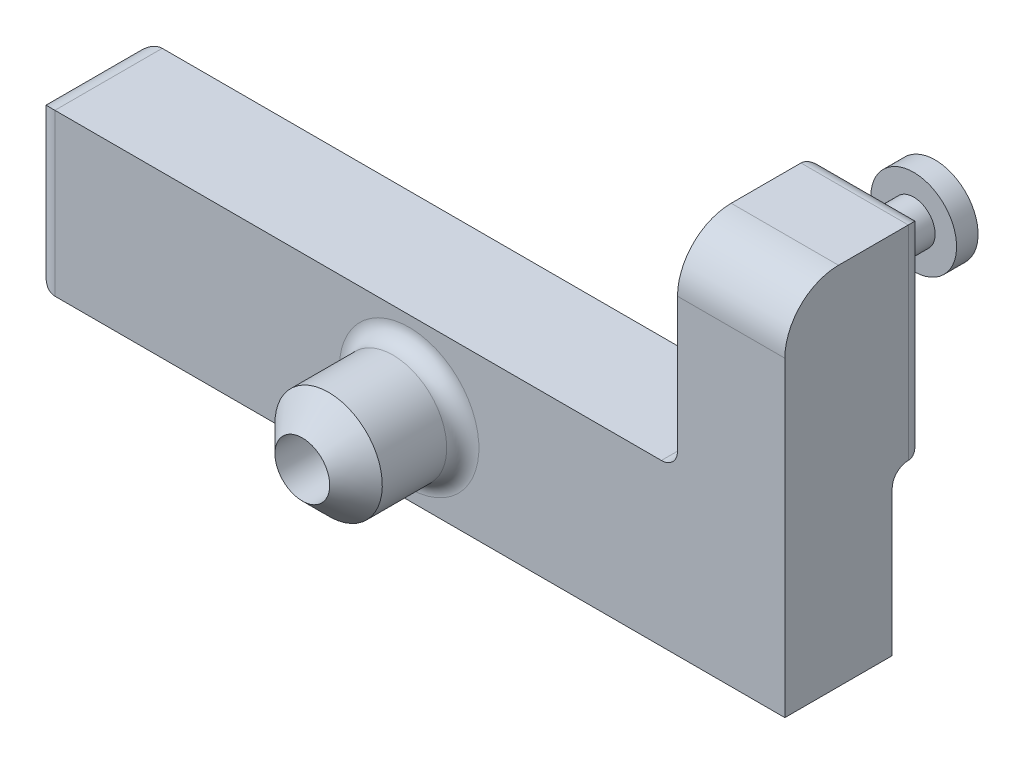
ISO-10303-21;
HEADER;
FILE_DESCRIPTION(('STEP AP214'),'2;1');
FILE_NAME('part.step','',(''),(''),'','','');
FILE_SCHEMA(('AUTOMOTIVE_DESIGN { 1 0 10303 214 1 1 1 1 }'));
ENDSEC;
DATA;
#1=APPLICATION_CONTEXT('core data for automotive mechanical design processes');
#2=APPLICATION_PROTOCOL_DEFINITION('international standard','automotive_design',2000,#1);
#3=PRODUCT_CONTEXT('',#1,'mechanical');
#4=PRODUCT('Part','Part','',(#3));
#5=PRODUCT_RELATED_PRODUCT_CATEGORY('part','',(#4));
#6=PRODUCT_DEFINITION_FORMATION('','',#4);
#7=PRODUCT_DEFINITION_CONTEXT('part definition',#1,'design');
#8=PRODUCT_DEFINITION('design','',#6,#7);
#9=PRODUCT_DEFINITION_SHAPE('','',#8);
#10=(LENGTH_UNIT() NAMED_UNIT(*) SI_UNIT(.MILLI.,.METRE.));
#11=(NAMED_UNIT(*) PLANE_ANGLE_UNIT() SI_UNIT($,.RADIAN.));
#12=(NAMED_UNIT(*) SI_UNIT($,.STERADIAN.) SOLID_ANGLE_UNIT());
#13=UNCERTAINTY_MEASURE_WITH_UNIT(LENGTH_MEASURE(1.E-05),#10,'distance_accuracy_value','');
#14=(GEOMETRIC_REPRESENTATION_CONTEXT(3) GLOBAL_UNCERTAINTY_ASSIGNED_CONTEXT((#13)) GLOBAL_UNIT_ASSIGNED_CONTEXT((#10,
#11,#12)) REPRESENTATION_CONTEXT('',''));
#15=CARTESIAN_POINT('',(0.,0.,0.));
#16=DIRECTION('',(0.,0.,1.));
#17=DIRECTION('',(1.,0.,0.));
#18=AXIS2_PLACEMENT_3D('',#15,#16,#17);
#19=CARTESIAN_POINT('',(30.,21.5,-7.));
#20=DIRECTION('',(0.,0.,1.));
#21=DIRECTION('',(1.,0.,0.));
#22=AXIS2_PLACEMENT_3D('',#19,#20,#21);
#23=CYLINDRICAL_SURFACE('',#22,2.);
#24=CARTESIAN_POINT('',(30.,21.5,-7.));
#25=DIRECTION('',(0.,0.,-1.));
#26=DIRECTION('',(-1.,0.,0.));
#27=AXIS2_PLACEMENT_3D('',#24,#25,#26);
#28=CIRCLE('',#27,2.);
#29=CARTESIAN_POINT('',(28.,21.5,-7.));
#30=VERTEX_POINT('',#29);
#31=EDGE_CURVE('E220',#30,#30,#28,.T.);
#32=ORIENTED_EDGE('',*,*,#31,.F.);
#33=EDGE_LOOP('',(#32));
#34=FACE_BOUND('',#33,.T.);
#35=CARTESIAN_POINT('',(30.,21.5,-3.));
#36=DIRECTION('',(0.,0.,-1.));
#37=DIRECTION('',(-1.,0.,0.));
#38=AXIS2_PLACEMENT_3D('',#35,#36,#37);
#39=CIRCLE('',#38,2.);
#40=CARTESIAN_POINT('',(28.,21.5,-3.));
#41=VERTEX_POINT('',#40);
#42=EDGE_CURVE('E219',#41,#41,#39,.T.);
#43=ORIENTED_EDGE('',*,*,#42,.T.);
#44=EDGE_LOOP('',(#43));
#45=FACE_BOUND('',#44,.T.);
#46=ADVANCED_FACE('F41',(#34,#45),#23,.T.);
#47=CARTESIAN_POINT('',(35.,26.5,-3.));
#48=DIRECTION('',(-1.,0.,0.));
#49=DIRECTION('',(0.,0.,1.));
#50=AXIS2_PLACEMENT_3D('',#47,#48,#49);
#51=PLANE('',#50);
#52=DIRECTION('',(0.,1.,0.));
#53=VECTOR('',#52,1.);
#54=CARTESIAN_POINT('',(35.,-7.5,0.));
#55=LINE('',#54,#53);
#56=CARTESIAN_POINT('',(35.,-7.5,0.));
#57=VERTEX_POINT('',#56);
#58=CARTESIAN_POINT('',(35.,6.,0.));
#59=VERTEX_POINT('',#58);
#60=EDGE_CURVE('E341',#57,#59,#55,.T.);
#61=ORIENTED_EDGE('',*,*,#60,.T.);
#62=CARTESIAN_POINT('',(35.,6.,-1.5));
#63=DIRECTION('',(-1.,0.,0.));
#64=DIRECTION('',(0.,0.,1.));
#65=AXIS2_PLACEMENT_3D('',#62,#63,#64);
#66=CIRCLE('',#65,1.5);
#67=CARTESIAN_POINT('',(35.,7.5,-1.5));
#68=VERTEX_POINT('',#67);
#69=EDGE_CURVE('E243',#59,#68,#66,.T.);
#70=ORIENTED_EDGE('',*,*,#69,.T.);
#71=DIRECTION('',(0.,-1.,0.));
#72=VECTOR('',#71,1.);
#73=CARTESIAN_POINT('',(35.,26.5,-1.5));
#74=LINE('',#73,#72);
#75=CARTESIAN_POINT('',(35.,26.5,-1.5));
#76=VERTEX_POINT('',#75);
#77=EDGE_CURVE('E239',#68,#76,#74,.F.);
#78=ORIENTED_EDGE('',*,*,#77,.T.);
#79=DIRECTION('',(0.,0.,1.));
#80=VECTOR('',#79,1.);
#81=CARTESIAN_POINT('',(35.,26.5,-3.));
#82=LINE('',#81,#80);
#83=CARTESIAN_POINT('',(35.,26.5,5.));
#84=VERTEX_POINT('',#83);
#85=EDGE_CURVE('E206',#76,#84,#82,.T.);
#86=ORIENTED_EDGE('',*,*,#85,.T.);
#87=CARTESIAN_POINT('',(35.,21.5,5.));
#88=DIRECTION('',(-1.,0.,0.));
#89=DIRECTION('',(0.,0.,1.));
#90=AXIS2_PLACEMENT_3D('',#87,#88,#89);
#91=CIRCLE('',#90,5.);
#92=CARTESIAN_POINT('',(35.,21.5,10.));
#93=VERTEX_POINT('',#92);
#94=EDGE_CURVE('E151',#84,#93,#91,.F.);
#95=ORIENTED_EDGE('',*,*,#94,.T.);
#96=DIRECTION('',(0.,-1.,0.));
#97=VECTOR('',#96,1.);
#98=CARTESIAN_POINT('',(35.,26.5,10.));
#99=LINE('',#98,#97);
#100=CARTESIAN_POINT('',(35.,-7.5,10.));
#101=VERTEX_POINT('',#100);
#102=EDGE_CURVE('E143',#93,#101,#99,.T.);
#103=ORIENTED_EDGE('',*,*,#102,.T.);
#104=DIRECTION('',(0.,0.,-1.));
#105=VECTOR('',#104,1.);
#106=CARTESIAN_POINT('',(35.,-7.5,10.));
#107=LINE('',#106,#105);
#108=EDGE_CURVE('E148',#101,#57,#107,.T.);
#109=ORIENTED_EDGE('',*,*,#108,.T.);
#110=EDGE_LOOP('',(#61,#70,#78,#86,#95,#103,#109));
#111=FACE_BOUND('',#110,.T.);
#112=ADVANCED_FACE('F146',(#111),#51,.F.);
#113=CARTESIAN_POINT('',(25.,26.5,-3.));
#114=DIRECTION('',(1.,0.,0.));
#115=DIRECTION('',(0.,1.,0.));
#116=AXIS2_PLACEMENT_3D('',#113,#114,#115);
#117=PLANE('',#116);
#118=DIRECTION('',(0.,1.,0.));
#119=VECTOR('',#118,1.);
#120=CARTESIAN_POINT('',(25.,7.50000000000001,-1.5));
#121=LINE('',#120,#119);
#122=CARTESIAN_POINT('',(25.,26.5,-1.5));
#123=VERTEX_POINT('',#122);
#124=CARTESIAN_POINT('',(25.,9.,-1.5));
#125=VERTEX_POINT('',#124);
#126=EDGE_CURVE('E235',#123,#125,#121,.F.);
#127=ORIENTED_EDGE('',*,*,#126,.T.);
#128=DIRECTION('',(0.,0.,1.));
#129=VECTOR('',#128,1.);
#130=CARTESIAN_POINT('',(25.,9.,10.));
#131=LINE('',#130,#129);
#132=CARTESIAN_POINT('',(25.,9.,10.));
#133=VERTEX_POINT('',#132);
#134=EDGE_CURVE('E64',#125,#133,#131,.T.);
#135=ORIENTED_EDGE('',*,*,#134,.T.);
#136=DIRECTION('',(0.,1.,0.));
#137=VECTOR('',#136,1.);
#138=CARTESIAN_POINT('',(25.,26.5,10.));
#139=LINE('',#138,#137);
#140=CARTESIAN_POINT('',(25.,21.5,10.));
#141=VERTEX_POINT('',#140);
#142=EDGE_CURVE('E154',#133,#141,#139,.T.);
#143=ORIENTED_EDGE('',*,*,#142,.T.);
#144=CARTESIAN_POINT('',(25.,21.5,5.));
#145=DIRECTION('',(1.,0.,0.));
#146=DIRECTION('',(0.,1.,0.));
#147=AXIS2_PLACEMENT_3D('',#144,#145,#146);
#148=CIRCLE('',#147,5.);
#149=CARTESIAN_POINT('',(25.,26.5,5.));
#150=VERTEX_POINT('',#149);
#151=EDGE_CURVE('E216',#141,#150,#148,.F.);
#152=ORIENTED_EDGE('',*,*,#151,.T.);
#153=DIRECTION('',(0.,0.,1.));
#154=VECTOR('',#153,1.);
#155=CARTESIAN_POINT('',(25.,26.5,-3.));
#156=LINE('',#155,#154);
#157=EDGE_CURVE('E208',#123,#150,#156,.T.);
#158=ORIENTED_EDGE('',*,*,#157,.F.);
#159=EDGE_LOOP('',(#127,#135,#143,#152,#158));
#160=FACE_BOUND('',#159,.T.);
#161=ADVANCED_FACE('F295',(#160),#117,.F.);
#162=CARTESIAN_POINT('',(35.,26.5,-3.));
#163=DIRECTION('',(0.,-1.,0.));
#164=DIRECTION('',(1.,0.,0.));
#165=AXIS2_PLACEMENT_3D('',#162,#163,#164);
#166=PLANE('',#165);
#167=ORIENTED_EDGE('',*,*,#85,.F.);
#168=DIRECTION('',(1.,0.,0.));
#169=VECTOR('',#168,1.);
#170=CARTESIAN_POINT('',(25.,26.5,-1.5));
#171=LINE('',#170,#169);
#172=EDGE_CURVE('E237',#76,#123,#171,.F.);
#173=ORIENTED_EDGE('',*,*,#172,.T.);
#174=ORIENTED_EDGE('',*,*,#157,.T.);
#175=DIRECTION('',(1.,0.,0.));
#176=VECTOR('',#175,1.);
#177=CARTESIAN_POINT('',(35.,26.5,5.));
#178=LINE('',#177,#176);
#179=EDGE_CURVE('E210',#150,#84,#178,.T.);
#180=ORIENTED_EDGE('',*,*,#179,.T.);
#181=EDGE_LOOP('',(#167,#173,#174,#180));
#182=FACE_BOUND('',#181,.T.);
#183=ADVANCED_FACE('F408',(#182),#166,.F.);
#184=CARTESIAN_POINT('',(0.,0.,-3.));
#185=DIRECTION('',(0.,0.,-1.));
#186=DIRECTION('',(-1.,0.,0.));
#187=AXIS2_PLACEMENT_3D('',#184,#185,#186);
#188=PLANE('',#187);
#189=DIRECTION('',(-1.,0.,0.));
#190=VECTOR('',#189,1.);
#191=CARTESIAN_POINT('',(25.,9.00000000000001,-3.));
#192=LINE('',#191,#190);
#193=CARTESIAN_POINT('',(33.5,9.,-3.));
#194=VERTEX_POINT('',#193);
#195=CARTESIAN_POINT('',(26.5,9.00000000000001,-3.));
#196=VERTEX_POINT('',#195);
#197=EDGE_CURVE('E223',#194,#196,#192,.T.);
#198=ORIENTED_EDGE('',*,*,#197,.T.);
#199=DIRECTION('',(0.,1.,0.));
#200=VECTOR('',#199,1.);
#201=CARTESIAN_POINT('',(26.5,26.5,-3.));
#202=LINE('',#201,#200);
#203=CARTESIAN_POINT('',(26.5,25.,-3.));
#204=VERTEX_POINT('',#203);
#205=EDGE_CURVE('E231',#196,#204,#202,.T.);
#206=ORIENTED_EDGE('',*,*,#205,.T.);
#207=DIRECTION('',(1.,0.,0.));
#208=VECTOR('',#207,1.);
#209=CARTESIAN_POINT('',(35.,25.,-3.));
#210=LINE('',#209,#208);
#211=CARTESIAN_POINT('',(33.5,25.,-3.));
#212=VERTEX_POINT('',#211);
#213=EDGE_CURVE('E229',#204,#212,#210,.T.);
#214=ORIENTED_EDGE('',*,*,#213,.T.);
#215=DIRECTION('',(0.,-1.,0.));
#216=VECTOR('',#215,1.);
#217=CARTESIAN_POINT('',(33.5,7.5,-3.));
#218=LINE('',#217,#216);
#219=EDGE_CURVE('E227',#212,#194,#218,.T.);
#220=ORIENTED_EDGE('',*,*,#219,.T.);
#221=EDGE_LOOP('',(#198,#206,#214,#220));
#222=FACE_BOUND('',#221,.T.);
#223=ORIENTED_EDGE('',*,*,#42,.F.);
#224=EDGE_LOOP('',(#223));
#225=FACE_BOUND('',#224,.T.);
#226=ADVANCED_FACE('F405',(#222,#225),#188,.T.);
#227=CARTESIAN_POINT('',(0.,0.,10.));
#228=DIRECTION('',(0.,0.,-1.));
#229=DIRECTION('',(-1.,0.,0.));
#230=AXIS2_PLACEMENT_3D('',#227,#228,#229);
#231=PLANE('',#230);
#232=CARTESIAN_POINT('',(0.,0.,10.));
#233=DIRECTION('',(0.,0.,-1.));
#234=DIRECTION('',(-1.,0.,0.));
#235=AXIS2_PLACEMENT_3D('',#232,#233,#234);
#236=CIRCLE('',#235,6.5);
#237=CARTESIAN_POINT('',(-6.5,0.,10.));
#238=VERTEX_POINT('',#237);
#239=EDGE_CURVE('E49',#238,#238,#236,.T.);
#240=ORIENTED_EDGE('',*,*,#239,.T.);
#241=EDGE_LOOP('',(#240));
#242=FACE_BOUND('',#241,.T.);
#243=ORIENTED_EDGE('',*,*,#102,.F.);
#244=DIRECTION('',(1.,0.,0.));
#245=VECTOR('',#244,1.);
#246=CARTESIAN_POINT('',(0.,21.5,10.));
#247=LINE('',#246,#245);
#248=EDGE_CURVE('E214',#93,#141,#247,.F.);
#249=ORIENTED_EDGE('',*,*,#248,.T.);
#250=ORIENTED_EDGE('',*,*,#142,.F.);
#251=CARTESIAN_POINT('',(23.5,9.,10.));
#252=DIRECTION('',(0.,0.,-1.));
#253=DIRECTION('',(-1.,0.,0.));
#254=AXIS2_PLACEMENT_3D('',#251,#252,#253);
#255=CIRCLE('',#254,1.5);
#256=CARTESIAN_POINT('',(23.5,7.5,10.));
#257=VERTEX_POINT('',#256);
#258=EDGE_CURVE('E56',#133,#257,#255,.T.);
#259=ORIENTED_EDGE('',*,*,#258,.T.);
#260=DIRECTION('',(-1.,0.,0.));
#261=VECTOR('',#260,1.);
#262=CARTESIAN_POINT('',(-35.,7.5,10.));
#263=LINE('',#262,#261);
#264=CARTESIAN_POINT('',(-33.,7.5,10.));
#265=VERTEX_POINT('',#264);
#266=EDGE_CURVE('E164',#257,#265,#263,.T.);
#267=ORIENTED_EDGE('',*,*,#266,.T.);
#268=DIRECTION('',(0.,-1.,0.));
#269=VECTOR('',#268,1.);
#270=CARTESIAN_POINT('',(-33.,0.,10.));
#271=LINE('',#270,#269);
#272=CARTESIAN_POINT('',(-33.,-7.5,10.));
#273=VERTEX_POINT('',#272);
#274=EDGE_CURVE('E161',#265,#273,#271,.T.);
#275=ORIENTED_EDGE('',*,*,#274,.T.);
#276=DIRECTION('',(1.,0.,0.));
#277=VECTOR('',#276,1.);
#278=CARTESIAN_POINT('',(-35.,-7.5,10.));
#279=LINE('',#278,#277);
#280=EDGE_CURVE('E158',#273,#101,#279,.T.);
#281=ORIENTED_EDGE('',*,*,#280,.T.);
#282=EDGE_LOOP('',(#243,#249,#250,#259,#267,#275,#281));
#283=FACE_BOUND('',#282,.T.);
#284=ADVANCED_FACE('F159',(#242,#283),#231,.F.);
#285=CARTESIAN_POINT('',(35.,21.5,5.));
#286=DIRECTION('',(1.,0.,0.));
#287=DIRECTION('',(0.,1.,0.));
#288=AXIS2_PLACEMENT_3D('',#285,#286,#287);
#289=CYLINDRICAL_SURFACE('',#288,5.);
#290=ORIENTED_EDGE('',*,*,#151,.F.);
#291=ORIENTED_EDGE('',*,*,#248,.F.);
#292=ORIENTED_EDGE('',*,*,#94,.F.);
#293=ORIENTED_EDGE('',*,*,#179,.F.);
#294=EDGE_LOOP('',(#290,#291,#292,#293));
#295=FACE_BOUND('',#294,.T.);
#296=ADVANCED_FACE('F301',(#295),#289,.T.);
#297=CARTESIAN_POINT('',(0.,0.,0.));
#298=DIRECTION('',(0.,0.,-1.));
#299=DIRECTION('',(-1.,0.,0.));
#300=AXIS2_PLACEMENT_3D('',#297,#298,#299);
#301=PLANE('',#300);
#302=DIRECTION('',(-1.,0.,0.));
#303=VECTOR('',#302,1.);
#304=CARTESIAN_POINT('',(-35.,7.5,0.));
#305=LINE('',#304,#303);
#306=CARTESIAN_POINT('',(23.5,7.5,0.));
#307=VERTEX_POINT('',#306);
#308=CARTESIAN_POINT('',(-33.,7.5,0.));
#309=VERTEX_POINT('',#308);
#310=EDGE_CURVE('E165',#307,#309,#305,.T.);
#311=ORIENTED_EDGE('',*,*,#310,.F.);
#312=DIRECTION('',(0.,-1.,0.));
#313=VECTOR('',#312,1.);
#314=CARTESIAN_POINT('',(23.5,0.,0.));
#315=LINE('',#314,#313);
#316=CARTESIAN_POINT('',(23.5,6.,0.));
#317=VERTEX_POINT('',#316);
#318=EDGE_CURVE('E245',#307,#317,#315,.T.);
#319=ORIENTED_EDGE('',*,*,#318,.T.);
#320=DIRECTION('',(-1.,0.,0.));
#321=VECTOR('',#320,1.);
#322=CARTESIAN_POINT('',(0.,6.00000000000002,0.));
#323=LINE('',#322,#321);
#324=EDGE_CURVE('E241',#317,#59,#323,.F.);
#325=ORIENTED_EDGE('',*,*,#324,.T.);
#326=ORIENTED_EDGE('',*,*,#60,.F.);
#327=DIRECTION('',(1.,0.,0.));
#328=VECTOR('',#327,1.);
#329=CARTESIAN_POINT('',(-35.,-7.5,0.));
#330=LINE('',#329,#328);
#331=CARTESIAN_POINT('',(-33.,-7.5,0.));
#332=VERTEX_POINT('',#331);
#333=EDGE_CURVE('E169',#332,#57,#330,.T.);
#334=ORIENTED_EDGE('',*,*,#333,.F.);
#335=DIRECTION('',(0.,-1.,0.));
#336=VECTOR('',#335,1.);
#337=CARTESIAN_POINT('',(-33.,7.5,0.));
#338=LINE('',#337,#336);
#339=EDGE_CURVE('E184',#332,#309,#338,.F.);
#340=ORIENTED_EDGE('',*,*,#339,.T.);
#341=EDGE_LOOP('',(#311,#319,#325,#326,#334,#340));
#342=FACE_BOUND('',#341,.T.);
#343=CARTESIAN_POINT('',(0.,0.,0.));
#344=DIRECTION('',(0.,0.,1.));
#345=DIRECTION('',(1.,0.,0.));
#346=AXIS2_PLACEMENT_3D('',#343,#344,#345);
#347=CIRCLE('',#346,2.55);
#348=CARTESIAN_POINT('',(2.55,0.,0.));
#349=VERTEX_POINT('',#348);
#350=EDGE_CURVE('E203',#349,#349,#347,.T.);
#351=ORIENTED_EDGE('',*,*,#350,.T.);
#352=EDGE_LOOP('',(#351));
#353=FACE_BOUND('',#352,.T.);
#354=ADVANCED_FACE('F338',(#342,#353),#301,.T.);
#355=CARTESIAN_POINT('',(-35.,-7.5,10.));
#356=DIRECTION('',(1.,0.,0.));
#357=DIRECTION('',(0.,0.,-1.));
#358=AXIS2_PLACEMENT_3D('',#355,#356,#357);
#359=PLANE('',#358);
#360=DIRECTION('',(0.,0.,-1.));
#361=VECTOR('',#360,1.);
#362=CARTESIAN_POINT('',(-35.,5.5,10.));
#363=LINE('',#362,#361);
#364=CARTESIAN_POINT('',(-35.,5.5,8.));
#365=VERTEX_POINT('',#364);
#366=CARTESIAN_POINT('',(-35.,5.5,2.));
#367=VERTEX_POINT('',#366);
#368=EDGE_CURVE('E170',#365,#367,#363,.T.);
#369=ORIENTED_EDGE('',*,*,#368,.T.);
#370=DIRECTION('',(0.,-1.,0.));
#371=VECTOR('',#370,1.);
#372=CARTESIAN_POINT('',(-35.,-7.5,2.));
#373=LINE('',#372,#371);
#374=CARTESIAN_POINT('',(-35.,-5.5,2.));
#375=VERTEX_POINT('',#374);
#376=EDGE_CURVE('E181',#367,#375,#373,.T.);
#377=ORIENTED_EDGE('',*,*,#376,.T.);
#378=DIRECTION('',(0.,0.,-1.));
#379=VECTOR('',#378,1.);
#380=CARTESIAN_POINT('',(-35.,-5.5,10.));
#381=LINE('',#380,#379);
#382=CARTESIAN_POINT('',(-35.,-5.5,8.));
#383=VERTEX_POINT('',#382);
#384=EDGE_CURVE('E179',#375,#383,#381,.F.);
#385=ORIENTED_EDGE('',*,*,#384,.T.);
#386=DIRECTION('',(0.,-1.,0.));
#387=VECTOR('',#386,1.);
#388=CARTESIAN_POINT('',(-35.,-7.5,8.));
#389=LINE('',#388,#387);
#390=EDGE_CURVE('E172',#383,#365,#389,.F.);
#391=ORIENTED_EDGE('',*,*,#390,.T.);
#392=EDGE_LOOP('',(#369,#377,#385,#391));
#393=FACE_BOUND('',#392,.T.);
#394=ADVANCED_FACE('F381',(#393),#359,.F.);
#395=CARTESIAN_POINT('',(-35.,-7.5,10.));
#396=DIRECTION('',(0.,1.,0.));
#397=DIRECTION('',(0.,0.,1.));
#398=AXIS2_PLACEMENT_3D('',#395,#396,#397);
#399=PLANE('',#398);
#400=ORIENTED_EDGE('',*,*,#280,.F.);
#401=DIRECTION('',(0.,0.,-1.));
#402=VECTOR('',#401,1.);
#403=CARTESIAN_POINT('',(-33.,-7.5,10.));
#404=LINE('',#403,#402);
#405=EDGE_CURVE('E187',#273,#332,#404,.T.);
#406=ORIENTED_EDGE('',*,*,#405,.T.);
#407=ORIENTED_EDGE('',*,*,#333,.T.);
#408=ORIENTED_EDGE('',*,*,#108,.F.);
#409=EDGE_LOOP('',(#400,#406,#407,#408));
#410=FACE_BOUND('',#409,.T.);
#411=ADVANCED_FACE('F167',(#410),#399,.F.);
#412=CARTESIAN_POINT('',(-35.,7.5,10.));
#413=DIRECTION('',(0.,-1.,0.));
#414=DIRECTION('',(1.,0.,0.));
#415=AXIS2_PLACEMENT_3D('',#412,#413,#414);
#416=PLANE('',#415);
#417=ORIENTED_EDGE('',*,*,#266,.F.);
#418=DIRECTION('',(0.,0.,1.));
#419=VECTOR('',#418,1.);
#420=CARTESIAN_POINT('',(23.5,7.5,0.));
#421=LINE('',#420,#419);
#422=EDGE_CURVE('E265',#257,#307,#421,.F.);
#423=ORIENTED_EDGE('',*,*,#422,.T.);
#424=ORIENTED_EDGE('',*,*,#310,.T.);
#425=DIRECTION('',(0.,0.,-1.));
#426=VECTOR('',#425,1.);
#427=CARTESIAN_POINT('',(-33.,7.5,10.));
#428=LINE('',#427,#426);
#429=EDGE_CURVE('E155',#309,#265,#428,.F.);
#430=ORIENTED_EDGE('',*,*,#429,.T.);
#431=EDGE_LOOP('',(#417,#423,#424,#430));
#432=FACE_BOUND('',#431,.T.);
#433=ADVANCED_FACE('F336',(#432),#416,.F.);
#434=CARTESIAN_POINT('',(0.,0.,10.));
#435=DIRECTION('',(0.,0.,-1.));
#436=DIRECTION('',(-1.,0.,0.));
#437=AXIS2_PLACEMENT_3D('',#434,#435,#436);
#438=CYLINDRICAL_SURFACE('',#437,2.55);
#439=ORIENTED_EDGE('',*,*,#350,.F.);
#440=EDGE_LOOP('',(#439));
#441=FACE_BOUND('',#440,.T.);
#442=CARTESIAN_POINT('',(0.,0.,19.95));
#443=DIRECTION('',(0.,0.,-1.));
#444=DIRECTION('',(0.,1.,0.));
#445=AXIS2_PLACEMENT_3D('',#442,#443,#444);
#446=CIRCLE('',#445,2.55);
#447=CARTESIAN_POINT('',(0.,2.55,19.95));
#448=VERTEX_POINT('',#447);
#449=EDGE_CURVE('E273',#448,#448,#446,.F.);
#450=ORIENTED_EDGE('',*,*,#449,.T.);
#451=EDGE_LOOP('',(#450));
#452=FACE_BOUND('',#451,.T.);
#453=ADVANCED_FACE('F374',(#441,#452),#438,.F.);
#454=CARTESIAN_POINT('',(-33.,0.,8.));
#455=DIRECTION('',(0.,-1.,0.));
#456=DIRECTION('',(0.,0.,-1.));
#457=AXIS2_PLACEMENT_3D('',#454,#455,#456);
#458=CYLINDRICAL_SURFACE('',#457,2.);
#459=CARTESIAN_POINT('',(-33.,-5.5,8.));
#460=DIRECTION('',(0.,-0.707106781186547,-0.707106781186547));
#461=DIRECTION('',(0.,-0.707106781186547,0.707106781186547));
#462=AXIS2_PLACEMENT_3D('',#459,#460,#461);
#463=ELLIPSE('',#462,2.82842712474619,2.);
#464=EDGE_CURVE('E198',#273,#383,#463,.T.);
#465=ORIENTED_EDGE('',*,*,#464,.F.);
#466=ORIENTED_EDGE('',*,*,#274,.F.);
#467=CARTESIAN_POINT('',(-33.,5.5,8.));
#468=DIRECTION('',(0.,0.707106781186547,-0.707106781186547));
#469=DIRECTION('',(0.,-0.707106781186547,-0.707106781186547));
#470=AXIS2_PLACEMENT_3D('',#467,#468,#469);
#471=ELLIPSE('',#470,2.82842712474619,2.);
#472=EDGE_CURVE('E201',#365,#265,#471,.T.);
#473=ORIENTED_EDGE('',*,*,#472,.F.);
#474=ORIENTED_EDGE('',*,*,#390,.F.);
#475=EDGE_LOOP('',(#465,#466,#473,#474));
#476=FACE_BOUND('',#475,.T.);
#477=ADVANCED_FACE('F377',(#476),#458,.T.);
#478=CARTESIAN_POINT('',(-33.,5.5,10.));
#479=DIRECTION('',(0.,0.,-1.));
#480=DIRECTION('',(-1.,0.,0.));
#481=AXIS2_PLACEMENT_3D('',#478,#479,#480);
#482=CYLINDRICAL_SURFACE('',#481,2.);
#483=ORIENTED_EDGE('',*,*,#472,.T.);
#484=ORIENTED_EDGE('',*,*,#429,.F.);
#485=CARTESIAN_POINT('',(-33.,5.5,2.));
#486=DIRECTION('',(0.,-0.707106781186547,-0.707106781186547));
#487=DIRECTION('',(0.,0.707106781186547,-0.707106781186547));
#488=AXIS2_PLACEMENT_3D('',#485,#486,#487);
#489=ELLIPSE('',#488,2.82842712474619,2.);
#490=EDGE_CURVE('E194',#367,#309,#489,.T.);
#491=ORIENTED_EDGE('',*,*,#490,.F.);
#492=ORIENTED_EDGE('',*,*,#368,.F.);
#493=EDGE_LOOP('',(#483,#484,#491,#492));
#494=FACE_BOUND('',#493,.T.);
#495=ADVANCED_FACE('F395',(#494),#482,.T.);
#496=CARTESIAN_POINT('',(-33.,-5.5,10.));
#497=DIRECTION('',(0.,0.,-1.));
#498=DIRECTION('',(-1.,0.,0.));
#499=AXIS2_PLACEMENT_3D('',#496,#497,#498);
#500=CYLINDRICAL_SURFACE('',#499,2.);
#501=ORIENTED_EDGE('',*,*,#464,.T.);
#502=ORIENTED_EDGE('',*,*,#384,.F.);
#503=CARTESIAN_POINT('',(-33.,-5.5,2.));
#504=DIRECTION('',(0.,0.707106781186547,-0.707106781186547));
#505=DIRECTION('',(0.,-0.707106781186547,-0.707106781186547));
#506=AXIS2_PLACEMENT_3D('',#503,#504,#505);
#507=ELLIPSE('',#506,2.82842712474619,2.);
#508=EDGE_CURVE('E192',#332,#375,#507,.T.);
#509=ORIENTED_EDGE('',*,*,#508,.F.);
#510=ORIENTED_EDGE('',*,*,#405,.F.);
#511=EDGE_LOOP('',(#501,#502,#509,#510));
#512=FACE_BOUND('',#511,.T.);
#513=ADVANCED_FACE('F391',(#512),#500,.T.);
#514=CARTESIAN_POINT('',(-33.,-7.5,2.));
#515=DIRECTION('',(0.,1.,0.));
#516=DIRECTION('',(0.,0.,1.));
#517=AXIS2_PLACEMENT_3D('',#514,#515,#516);
#518=CYLINDRICAL_SURFACE('',#517,2.);
#519=ORIENTED_EDGE('',*,*,#490,.T.);
#520=ORIENTED_EDGE('',*,*,#339,.F.);
#521=ORIENTED_EDGE('',*,*,#508,.T.);
#522=ORIENTED_EDGE('',*,*,#376,.F.);
#523=EDGE_LOOP('',(#519,#520,#521,#522));
#524=FACE_BOUND('',#523,.T.);
#525=ADVANCED_FACE('F372',(#524),#518,.T.);
#526=CARTESIAN_POINT('',(30.,21.5,-9.));
#527=DIRECTION('',(0.,0.,1.));
#528=DIRECTION('',(1.,0.,0.));
#529=AXIS2_PLACEMENT_3D('',#526,#527,#528);
#530=CYLINDRICAL_SURFACE('',#529,4.);
#531=CARTESIAN_POINT('',(30.,21.5,-9.));
#532=DIRECTION('',(0.,0.,-1.));
#533=DIRECTION('',(-1.,0.,0.));
#534=AXIS2_PLACEMENT_3D('',#531,#532,#533);
#535=CIRCLE('',#534,4.);
#536=CARTESIAN_POINT('',(26.,21.5,-9.));
#537=VERTEX_POINT('',#536);
#538=EDGE_CURVE('E195',#537,#537,#535,.T.);
#539=ORIENTED_EDGE('',*,*,#538,.F.);
#540=EDGE_LOOP('',(#539));
#541=FACE_BOUND('',#540,.T.);
#542=CARTESIAN_POINT('',(30.,21.5,-7.));
#543=DIRECTION('',(0.,0.,-1.));
#544=DIRECTION('',(-1.,0.,0.));
#545=AXIS2_PLACEMENT_3D('',#542,#543,#544);
#546=CIRCLE('',#545,4.);
#547=CARTESIAN_POINT('',(26.,21.5,-7.));
#548=VERTEX_POINT('',#547);
#549=EDGE_CURVE('E261',#548,#548,#546,.T.);
#550=ORIENTED_EDGE('',*,*,#549,.T.);
#551=EDGE_LOOP('',(#550));
#552=FACE_BOUND('',#551,.T.);
#553=ADVANCED_FACE('F365',(#541,#552),#530,.T.);
#554=CARTESIAN_POINT('',(30.,21.5,-9.));
#555=DIRECTION('',(0.,0.,-1.));
#556=DIRECTION('',(-1.,0.,0.));
#557=AXIS2_PLACEMENT_3D('',#554,#555,#556);
#558=PLANE('',#557);
#559=ORIENTED_EDGE('',*,*,#538,.T.);
#560=EDGE_LOOP('',(#559));
#561=FACE_BOUND('',#560,.T.);
#562=ADVANCED_FACE('F362',(#561),#558,.T.);
#563=CARTESIAN_POINT('',(30.,21.5,-7.));
#564=DIRECTION('',(0.,0.,-1.));
#565=DIRECTION('',(-1.,0.,0.));
#566=AXIS2_PLACEMENT_3D('',#563,#564,#565);
#567=PLANE('',#566);
#568=ORIENTED_EDGE('',*,*,#31,.T.);
#569=EDGE_LOOP('',(#568));
#570=FACE_BOUND('',#569,.T.);
#571=ORIENTED_EDGE('',*,*,#549,.F.);
#572=EDGE_LOOP('',(#571));
#573=FACE_BOUND('',#572,.T.);
#574=ADVANCED_FACE('F322',(#570,#573),#567,.F.);
#575=CARTESIAN_POINT('',(35.,6.,-1.5));
#576=DIRECTION('',(-1.,0.,0.));
#577=DIRECTION('',(0.,-1.,0.));
#578=AXIS2_PLACEMENT_3D('',#575,#576,#577);
#579=CYLINDRICAL_SURFACE('',#578,1.5);
#580=ORIENTED_EDGE('',*,*,#324,.F.);
#581=CARTESIAN_POINT('',(23.5,6.00000000000001,-1.5));
#582=DIRECTION('',(-0.707106781186547,0.707106781186548,0.));
#583=DIRECTION('',(-0.707106781186548,-0.707106781186547,0.));
#584=AXIS2_PLACEMENT_3D('',#581,#582,#583);
#585=ELLIPSE('',#584,2.12132034355964,1.5);
#586=CARTESIAN_POINT('',(25.,7.50000000000001,-1.5));
#587=VERTEX_POINT('',#586);
#588=EDGE_CURVE('E267',#317,#587,#585,.T.);
#589=ORIENTED_EDGE('',*,*,#588,.T.);
#590=DIRECTION('',(-1.,0.,0.));
#591=VECTOR('',#590,1.);
#592=CARTESIAN_POINT('',(35.,7.5,-1.5));
#593=LINE('',#592,#591);
#594=EDGE_CURVE('E258',#68,#587,#593,.T.);
#595=ORIENTED_EDGE('',*,*,#594,.F.);
#596=ORIENTED_EDGE('',*,*,#69,.F.);
#597=EDGE_LOOP('',(#580,#589,#595,#596));
#598=FACE_BOUND('',#597,.T.);
#599=ADVANCED_FACE('F318',(#598),#579,.F.);
#600=CARTESIAN_POINT('',(33.5,0.,-1.5));
#601=DIRECTION('',(0.,1.,0.));
#602=DIRECTION('',(0.,0.,1.));
#603=AXIS2_PLACEMENT_3D('',#600,#601,#602);
#604=CYLINDRICAL_SURFACE('',#603,1.5);
#605=CARTESIAN_POINT('',(33.5,25.,-1.5));
#606=DIRECTION('',(-0.707106781186547,0.707106781186548,0.));
#607=DIRECTION('',(0.707106781186548,0.707106781186547,0.));
#608=AXIS2_PLACEMENT_3D('',#605,#606,#607);
#609=ELLIPSE('',#608,2.12132034355964,1.5);
#610=EDGE_CURVE('E252',#76,#212,#609,.T.);
#611=ORIENTED_EDGE('',*,*,#610,.F.);
#612=ORIENTED_EDGE('',*,*,#77,.F.);
#613=CARTESIAN_POINT('',(33.5,9.,-1.5));
#614=DIRECTION('',(0.707106781186548,0.707106781186547,0.));
#615=DIRECTION('',(0.707106781186547,-0.707106781186548,0.));
#616=AXIS2_PLACEMENT_3D('',#613,#614,#615);
#617=ELLIPSE('',#616,2.12132034355964,1.5);
#618=EDGE_CURVE('E255',#194,#68,#617,.F.);
#619=ORIENTED_EDGE('',*,*,#618,.F.);
#620=ORIENTED_EDGE('',*,*,#219,.F.);
#621=EDGE_LOOP('',(#611,#612,#619,#620));
#622=FACE_BOUND('',#621,.T.);
#623=ADVANCED_FACE('F314',(#622),#604,.T.);
#624=CARTESIAN_POINT('',(0.,9.00000000000002,-1.5));
#625=DIRECTION('',(1.,0.,0.));
#626=DIRECTION('',(0.,1.,0.));
#627=AXIS2_PLACEMENT_3D('',#624,#625,#626);
#628=CYLINDRICAL_SURFACE('',#627,1.5);
#629=ORIENTED_EDGE('',*,*,#618,.T.);
#630=ORIENTED_EDGE('',*,*,#594,.T.);
#631=CARTESIAN_POINT('',(26.5,9.00000000000001,-1.5));
#632=DIRECTION('',(0.707106781186547,-0.707106781186548,0.));
#633=DIRECTION('',(0.707106781186548,0.707106781186547,0.));
#634=AXIS2_PLACEMENT_3D('',#631,#632,#633);
#635=ELLIPSE('',#634,2.12132034355964,1.5);
#636=EDGE_CURVE('E248',#196,#587,#635,.F.);
#637=ORIENTED_EDGE('',*,*,#636,.F.);
#638=ORIENTED_EDGE('',*,*,#197,.F.);
#639=EDGE_LOOP('',(#629,#630,#637,#638));
#640=FACE_BOUND('',#639,.T.);
#641=ADVANCED_FACE('F310',(#640),#628,.T.);
#642=CARTESIAN_POINT('',(0.,25.,-1.5));
#643=DIRECTION('',(-1.,0.,0.));
#644=DIRECTION('',(0.,-1.,0.));
#645=AXIS2_PLACEMENT_3D('',#642,#643,#644);
#646=CYLINDRICAL_SURFACE('',#645,1.5);
#647=ORIENTED_EDGE('',*,*,#610,.T.);
#648=ORIENTED_EDGE('',*,*,#213,.F.);
#649=CARTESIAN_POINT('',(26.5,25.,-1.5));
#650=DIRECTION('',(-0.707106781186548,-0.707106781186547,0.));
#651=DIRECTION('',(-0.707106781186547,0.707106781186548,0.));
#652=AXIS2_PLACEMENT_3D('',#649,#650,#651);
#653=ELLIPSE('',#652,2.12132034355964,1.5);
#654=EDGE_CURVE('E246',#123,#204,#653,.T.);
#655=ORIENTED_EDGE('',*,*,#654,.F.);
#656=ORIENTED_EDGE('',*,*,#172,.F.);
#657=EDGE_LOOP('',(#647,#648,#655,#656));
#658=FACE_BOUND('',#657,.T.);
#659=ADVANCED_FACE('F306',(#658),#646,.T.);
#660=CARTESIAN_POINT('',(26.5,0.,-1.5));
#661=DIRECTION('',(0.,-1.,0.));
#662=DIRECTION('',(1.,0.,0.));
#663=AXIS2_PLACEMENT_3D('',#660,#661,#662);
#664=CYLINDRICAL_SURFACE('',#663,1.5);
#665=ORIENTED_EDGE('',*,*,#636,.T.);
#666=EDGE_CURVE('E234',#125,#587,#121,.F.);
#667=ORIENTED_EDGE('',*,*,#666,.F.);
#668=ORIENTED_EDGE('',*,*,#126,.F.);
#669=ORIENTED_EDGE('',*,*,#654,.T.);
#670=ORIENTED_EDGE('',*,*,#205,.F.);
#671=EDGE_LOOP('',(#665,#667,#668,#669,#670));
#672=FACE_BOUND('',#671,.T.);
#673=ADVANCED_FACE('F302',(#672),#664,.T.);
#674=CARTESIAN_POINT('',(23.5,9.,-3.));
#675=DIRECTION('',(0.,0.,-1.));
#676=DIRECTION('',(-1.,0.,0.));
#677=AXIS2_PLACEMENT_3D('',#674,#675,#676);
#678=CYLINDRICAL_SURFACE('',#677,1.5);
#679=ORIENTED_EDGE('',*,*,#258,.F.);
#680=ORIENTED_EDGE('',*,*,#134,.F.);
#681=CARTESIAN_POINT('',(23.5,9.,-1.5));
#682=DIRECTION('',(0.,-0.707106781186547,-0.707106781186547));
#683=DIRECTION('',(0.,0.707106781186547,-0.707106781186547));
#684=AXIS2_PLACEMENT_3D('',#681,#682,#683);
#685=ELLIPSE('',#684,2.12132034355964,1.5);
#686=EDGE_CURVE('E249',#307,#125,#685,.F.);
#687=ORIENTED_EDGE('',*,*,#686,.F.);
#688=ORIENTED_EDGE('',*,*,#422,.F.);
#689=EDGE_LOOP('',(#679,#680,#687,#688));
#690=FACE_BOUND('',#689,.T.);
#691=ADVANCED_FACE('F305',(#690),#678,.F.);
#692=CARTESIAN_POINT('',(23.5,0.,-1.5));
#693=DIRECTION('',(0.,-1.,0.));
#694=DIRECTION('',(1.,0.,0.));
#695=AXIS2_PLACEMENT_3D('',#692,#693,#694);
#696=CYLINDRICAL_SURFACE('',#695,1.5);
#697=ORIENTED_EDGE('',*,*,#686,.T.);
#698=ORIENTED_EDGE('',*,*,#666,.T.);
#699=ORIENTED_EDGE('',*,*,#588,.F.);
#700=ORIENTED_EDGE('',*,*,#318,.F.);
#701=EDGE_LOOP('',(#697,#698,#699,#700));
#702=FACE_BOUND('',#701,.T.);
#703=ADVANCED_FACE('F324',(#702),#696,.F.);
#704=CARTESIAN_POINT('',(0.,0.,17.5));
#705=DIRECTION('',(0.,0.,-1.));
#706=DIRECTION('',(0.,1.,0.));
#707=AXIS2_PLACEMENT_3D('',#704,#705,#706);
#708=CONICAL_SURFACE('',#707,5.,0.78539816339745);
#709=ORIENTED_EDGE('',*,*,#449,.F.);
#710=EDGE_LOOP('',(#709));
#711=FACE_BOUND('',#710,.T.);
#712=CARTESIAN_POINT('',(0.,0.,17.5));
#713=DIRECTION('',(0.,0.,-1.));
#714=DIRECTION('',(0.,1.,0.));
#715=AXIS2_PLACEMENT_3D('',#712,#713,#714);
#716=CIRCLE('',#715,5.);
#717=CARTESIAN_POINT('',(0.,5.,17.5));
#718=VERTEX_POINT('',#717);
#719=EDGE_CURVE('E272',#718,#718,#716,.T.);
#720=ORIENTED_EDGE('',*,*,#719,.F.);
#721=EDGE_LOOP('',(#720));
#722=FACE_BOUND('',#721,.T.);
#723=ADVANCED_FACE('F285',(#711,#722),#708,.T.);
#724=CARTESIAN_POINT('',(0.,0.,10.));
#725=DIRECTION('',(0.,0.,-1.));
#726=DIRECTION('',(0.,1.,0.));
#727=AXIS2_PLACEMENT_3D('',#724,#725,#726);
#728=CYLINDRICAL_SURFACE('',#727,5.);
#729=CARTESIAN_POINT('',(0.,0.,11.5));
#730=DIRECTION('',(0.,0.,-1.));
#731=DIRECTION('',(-1.,0.,0.));
#732=AXIS2_PLACEMENT_3D('',#729,#730,#731);
#733=CIRCLE('',#732,5.);
#734=CARTESIAN_POINT('',(-5.,0.,11.5));
#735=VERTEX_POINT('',#734);
#736=EDGE_CURVE('E11',#735,#735,#733,.F.);
#737=ORIENTED_EDGE('',*,*,#736,.T.);
#738=EDGE_LOOP('',(#737));
#739=FACE_BOUND('',#738,.T.);
#740=ORIENTED_EDGE('',*,*,#719,.T.);
#741=EDGE_LOOP('',(#740));
#742=FACE_BOUND('',#741,.T.);
#743=ADVANCED_FACE('F280',(#739,#742),#728,.T.);
#744=CARTESIAN_POINT('',(0.,0.,11.5));
#745=DIRECTION('',(0.,0.,-1.));
#746=DIRECTION('',(-1.,0.,0.));
#747=AXIS2_PLACEMENT_3D('',#744,#745,#746);
#748=TOROIDAL_SURFACE('',#747,6.5,1.5);
#749=ORIENTED_EDGE('',*,*,#736,.F.);
#750=EDGE_LOOP('',(#749));
#751=FACE_BOUND('',#750,.T.);
#752=ORIENTED_EDGE('',*,*,#239,.F.);
#753=EDGE_LOOP('',(#752));
#754=FACE_BOUND('',#753,.T.);
#755=ADVANCED_FACE('F43',(#751,#754),#748,.F.);
#756=CLOSED_SHELL('',(#46,#112,#161,#183,#226,#284,#296,#354,#394,#411,#433,#453,#477,#495,#513,
#525,#553,#562,#574,#599,#623,#641,#659,#673,#691,#703,#723,#743,#755));
#757=MANIFOLD_SOLID_BREP('B2',#756);
#758=ADVANCED_BREP_SHAPE_REPRESENTATION('',(#18,#757),#14);
#759=SHAPE_DEFINITION_REPRESENTATION(#9,#758);
ENDSEC;
END-ISO-10303-21;
